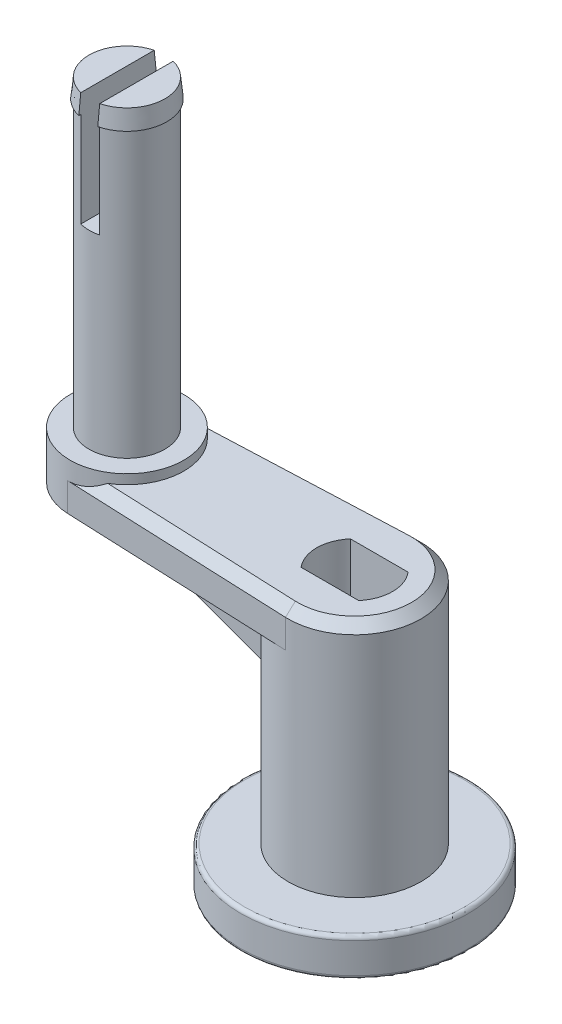
ISO-10303-21;
HEADER;
FILE_DESCRIPTION(('STEP AP214'),'2;1');
FILE_NAME('part.step','',(''),(''),'','','');
FILE_SCHEMA(('AUTOMOTIVE_DESIGN { 1 0 10303 214 1 1 1 1 }'));
ENDSEC;
DATA;
#1=APPLICATION_CONTEXT('core data for automotive mechanical design processes');
#2=APPLICATION_PROTOCOL_DEFINITION('international standard','automotive_design',2000,#1);
#3=PRODUCT_CONTEXT('',#1,'mechanical');
#4=PRODUCT('Part','Part','',(#3));
#5=PRODUCT_RELATED_PRODUCT_CATEGORY('part','',(#4));
#6=PRODUCT_DEFINITION_FORMATION('','',#4);
#7=PRODUCT_DEFINITION_CONTEXT('part definition',#1,'design');
#8=PRODUCT_DEFINITION('design','',#6,#7);
#9=PRODUCT_DEFINITION_SHAPE('','',#8);
#10=(LENGTH_UNIT() NAMED_UNIT(*) SI_UNIT(.MILLI.,.METRE.));
#11=(NAMED_UNIT(*) PLANE_ANGLE_UNIT() SI_UNIT($,.RADIAN.));
#12=(NAMED_UNIT(*) SI_UNIT($,.STERADIAN.) SOLID_ANGLE_UNIT());
#13=UNCERTAINTY_MEASURE_WITH_UNIT(LENGTH_MEASURE(1.E-05),#10,'distance_accuracy_value','');
#14=(GEOMETRIC_REPRESENTATION_CONTEXT(3) GLOBAL_UNCERTAINTY_ASSIGNED_CONTEXT((#13)) GLOBAL_UNIT_ASSIGNED_CONTEXT((#10,
#11,#12)) REPRESENTATION_CONTEXT('',''));
#15=CARTESIAN_POINT('',(0.,0.,0.));
#16=DIRECTION('',(0.,0.,1.));
#17=DIRECTION('',(1.,0.,0.));
#18=AXIS2_PLACEMENT_3D('',#15,#16,#17);
#19=CARTESIAN_POINT('',(-14.1,30.,0.));
#20=DIRECTION('',(0.,1.,0.));
#21=DIRECTION('',(0.,0.,1.));
#22=AXIS2_PLACEMENT_3D('',#19,#20,#21);
#23=PLANE('',#22);
#24=CARTESIAN_POINT('',(-12.,30.,0.));
#25=DIRECTION('',(0.,-1.,0.));
#26=DIRECTION('',(0.,0.,-1.));
#27=AXIS2_PLACEMENT_3D('',#24,#25,#26);
#28=CIRCLE('',#27,2.1);
#29=CARTESIAN_POINT('',(-11.5,30.,-2.03960780543711));
#30=VERTEX_POINT('',#29);
#31=CARTESIAN_POINT('',(-11.5,30.,2.03960780543711));
#32=VERTEX_POINT('',#31);
#33=EDGE_CURVE('E300',#30,#32,#28,.T.);
#34=ORIENTED_EDGE('',*,*,#33,.T.);
#35=DIRECTION('',(0.,0.,-1.));
#36=VECTOR('',#35,1.);
#37=CARTESIAN_POINT('',(-11.5,30.,0.));
#38=LINE('',#37,#36);
#39=CARTESIAN_POINT('',(-11.5,30.,1.93649167310371));
#40=VERTEX_POINT('',#39);
#41=EDGE_CURVE('E283',#32,#40,#38,.T.);
#42=ORIENTED_EDGE('',*,*,#41,.T.);
#43=CARTESIAN_POINT('',(-12.,30.,0.));
#44=DIRECTION('',(0.,1.,0.));
#45=DIRECTION('',(0.,0.,1.));
#46=AXIS2_PLACEMENT_3D('',#43,#44,#45);
#47=CIRCLE('',#46,2.);
#48=CARTESIAN_POINT('',(-11.5,30.,-1.9364916731037));
#49=VERTEX_POINT('',#48);
#50=EDGE_CURVE('E491',#40,#49,#47,.T.);
#51=ORIENTED_EDGE('',*,*,#50,.T.);
#52=EDGE_CURVE('E287',#49,#30,#38,.T.);
#53=ORIENTED_EDGE('',*,*,#52,.T.);
#54=EDGE_LOOP('',(#34,#42,#51,#53));
#55=FACE_BOUND('',#54,.T.);
#56=ADVANCED_FACE('F34',(#55),#23,.F.);
#57=CARTESIAN_POINT('',(-12.,31.,0.));
#58=DIRECTION('',(0.,-1.,0.));
#59=DIRECTION('',(0.,0.,-1.));
#60=AXIS2_PLACEMENT_3D('',#57,#58,#59);
#61=CONICAL_SURFACE('',#60,2.,0.0996686524911613);
#62=ORIENTED_EDGE('',*,*,#33,.F.);
#63=CARTESIAN_POINT('',(-11.5,26.841130436013,-2.36357986666356));
#64=CARTESIAN_POINT('',(-11.5,27.4581092019345,-2.30051294550378));
#65=CARTESIAN_POINT('',(-11.5,28.075077794743,-2.23734624093098));
#66=CARTESIAN_POINT('',(-11.5,29.3089863140136,-2.1107357912917));
#67=CARTESIAN_POINT('',(-11.5,29.9259262404865,-2.04729204632902));
#68=CARTESIAN_POINT('',(-11.5,31.1597696902874,-1.92004998262336));
#69=CARTESIAN_POINT('',(-11.5,31.7766732136083,-1.85625166381081));
#70=CARTESIAN_POINT('',(-11.5,33.0104289475399,-1.72815870123598));
#71=CARTESIAN_POINT('',(-11.5,33.627281158131,-1.66386405728527));
#72=CARTESIAN_POINT('',(-11.5,34.2441000838575,-1.59925039315231));
#73=B_SPLINE_CURVE_WITH_KNOTS('',3,(#63,#64,#65,#66,#67,#68,#69,#70,#71,#72),.UNSPECIFIED.,.F.,
.F.,(4,2,2,2,4),(0.,1.86058114819701,3.72116159936956,5.58174241557318,7.44232393822369),.UNSPECIFIED.);
#74=CARTESIAN_POINT('',(-11.5,31.,-1.93649167310371));
#75=VERTEX_POINT('',#74);
#76=EDGE_CURVE('E290',#30,#75,#73,.T.);
#77=ORIENTED_EDGE('',*,*,#76,.T.);
#78=CARTESIAN_POINT('',(-12.,31.,0.));
#79=DIRECTION('',(0.,-1.,0.));
#80=DIRECTION('',(0.,0.,-1.));
#81=AXIS2_PLACEMENT_3D('',#78,#79,#80);
#82=CIRCLE('',#81,2.);
#83=CARTESIAN_POINT('',(-11.5,31.,1.93649167310371));
#84=VERTEX_POINT('',#83);
#85=EDGE_CURVE('E304',#75,#84,#82,.T.);
#86=ORIENTED_EDGE('',*,*,#85,.T.);
#87=CARTESIAN_POINT('',(-11.5,34.2441000838575,1.59925039315231));
#88=CARTESIAN_POINT('',(-11.5,33.2336599431167,1.70508949991539));
#89=CARTESIAN_POINT('',(-11.5,32.2231318658387,1.81008354046584));
#90=CARTESIAN_POINT('',(-11.5,30.9893168649101,1.93760388991941));
#91=CARTESIAN_POINT('',(-11.5,30.766083590966,1.96064915154205));
#92=CARTESIAN_POINT('',(-11.5,29.9259262174672,2.04729297394069));
#93=CARTESIAN_POINT('',(-11.5,29.3089861080309,2.11073627491152));
#94=CARTESIAN_POINT('',(-11.5,28.0750774821184,2.23734581002695));
#95=CARTESIAN_POINT('',(-11.5,27.4581089656435,2.3005120441842));
#96=CARTESIAN_POINT('',(-11.5,26.841130436013,2.36357986666356));
#97=B_SPLINE_CURVE_WITH_KNOTS('',3,(#87,#88,#89,#90,#91,#92,#93,#94,#95,#96),.UNSPECIFIED.,.F.,
.F.,(4,2,2,2,4),(0.,3.04790325494799,3.72116219415059,5.58174303628262,7.44232379352004),.UNSPECIFIED.);
#98=EDGE_CURVE('E277',#84,#32,#97,.T.);
#99=ORIENTED_EDGE('',*,*,#98,.T.);
#100=EDGE_LOOP('',(#62,#77,#86,#99));
#101=FACE_BOUND('',#100,.T.);
#102=ADVANCED_FACE('F459',(#101),#61,.T.);
#103=CARTESIAN_POINT('',(-12.,31.,0.));
#104=DIRECTION('',(0.,1.,0.));
#105=DIRECTION('',(0.,0.,1.));
#106=AXIS2_PLACEMENT_3D('',#103,#104,#105);
#107=PLANE('',#106);
#108=DIRECTION('',(0.,0.,-1.));
#109=VECTOR('',#108,1.);
#110=CARTESIAN_POINT('',(-11.5,31.,0.));
#111=LINE('',#110,#109);
#112=EDGE_CURVE('E490',#84,#75,#111,.T.);
#113=ORIENTED_EDGE('',*,*,#112,.F.);
#114=ORIENTED_EDGE('',*,*,#85,.F.);
#115=EDGE_LOOP('',(#113,#114));
#116=FACE_BOUND('',#115,.T.);
#117=ADVANCED_FACE('F465',(#116),#107,.T.);
#118=CARTESIAN_POINT('',(-12.,31.,0.));
#119=DIRECTION('',(0.,-1.,0.));
#120=DIRECTION('',(0.,0.,-1.));
#121=AXIS2_PLACEMENT_3D('',#118,#119,#120);
#122=CYLINDRICAL_SURFACE('',#121,2.);
#123=ORIENTED_EDGE('',*,*,#50,.F.);
#124=DIRECTION('',(0.,-1.,0.));
#125=VECTOR('',#124,1.);
#126=CARTESIAN_POINT('',(-11.5,31.,1.93649167310371));
#127=LINE('',#126,#125);
#128=CARTESIAN_POINT('',(-11.5,25.,1.93649167310371));
#129=VERTEX_POINT('',#128);
#130=EDGE_CURVE('E286',#40,#129,#127,.T.);
#131=ORIENTED_EDGE('',*,*,#130,.T.);
#132=CARTESIAN_POINT('',(-12.,25.,0.));
#133=DIRECTION('',(0.,-1.,0.));
#134=DIRECTION('',(0.,0.,-1.));
#135=AXIS2_PLACEMENT_3D('',#132,#133,#134);
#136=CIRCLE('',#135,2.);
#137=CARTESIAN_POINT('',(-12.5,25.,1.93649167310371));
#138=VERTEX_POINT('',#137);
#139=EDGE_CURVE('E500',#129,#138,#136,.T.);
#140=ORIENTED_EDGE('',*,*,#139,.T.);
#141=DIRECTION('',(0.,-1.,0.));
#142=VECTOR('',#141,1.);
#143=CARTESIAN_POINT('',(-12.5,31.,1.93649167310371));
#144=LINE('',#143,#142);
#145=CARTESIAN_POINT('',(-12.5,30.,1.93649167310371));
#146=VERTEX_POINT('',#145);
#147=EDGE_CURVE('E273',#138,#146,#144,.F.);
#148=ORIENTED_EDGE('',*,*,#147,.T.);
#149=CARTESIAN_POINT('',(-12.5,30.,-1.93649167310371));
#150=VERTEX_POINT('',#149);
#151=EDGE_CURVE('E359',#150,#146,#47,.T.);
#152=ORIENTED_EDGE('',*,*,#151,.F.);
#153=DIRECTION('',(0.,-1.,0.));
#154=VECTOR('',#153,1.);
#155=CARTESIAN_POINT('',(-12.5,31.,-1.93649167310371));
#156=LINE('',#155,#154);
#157=CARTESIAN_POINT('',(-12.5,25.,-1.93649167310371));
#158=VERTEX_POINT('',#157);
#159=EDGE_CURVE('E274',#150,#158,#156,.T.);
#160=ORIENTED_EDGE('',*,*,#159,.T.);
#161=CARTESIAN_POINT('',(-11.5,25.,-1.9364916731037));
#162=VERTEX_POINT('',#161);
#163=EDGE_CURVE('E493',#158,#162,#136,.T.);
#164=ORIENTED_EDGE('',*,*,#163,.T.);
#165=DIRECTION('',(0.,-1.,0.));
#166=VECTOR('',#165,1.);
#167=CARTESIAN_POINT('',(-11.5,31.,-1.9364916731037));
#168=LINE('',#167,#166);
#169=EDGE_CURVE('E296',#162,#49,#168,.F.);
#170=ORIENTED_EDGE('',*,*,#169,.T.);
#171=EDGE_LOOP('',(#123,#131,#140,#148,#152,#160,#164,#170));
#172=FACE_BOUND('',#171,.T.);
#173=CARTESIAN_POINT('',(-12.,15.,0.));
#174=DIRECTION('',(0.,1.,0.));
#175=DIRECTION('',(0.,0.,1.));
#176=AXIS2_PLACEMENT_3D('',#173,#174,#175);
#177=CIRCLE('',#176,2.);
#178=CARTESIAN_POINT('',(-12.,15.,2.));
#179=VERTEX_POINT('',#178);
#180=EDGE_CURVE('E307',#179,#179,#177,.T.);
#181=ORIENTED_EDGE('',*,*,#180,.T.);
#182=EDGE_LOOP('',(#181));
#183=FACE_BOUND('',#182,.T.);
#184=ADVANCED_FACE('F540',(#172,#183),#122,.T.);
#185=CARTESIAN_POINT('',(-12.,15.,0.));
#186=DIRECTION('',(0.,1.,0.));
#187=DIRECTION('',(0.,0.,1.));
#188=AXIS2_PLACEMENT_3D('',#185,#186,#187);
#189=PLANE('',#188);
#190=CARTESIAN_POINT('',(-12.,15.,0.));
#191=DIRECTION('',(0.,1.,0.));
#192=DIRECTION('',(0.,0.,1.));
#193=AXIS2_PLACEMENT_3D('',#190,#191,#192);
#194=CIRCLE('',#193,3.);
#195=CARTESIAN_POINT('',(-12.,15.,3.));
#196=VERTEX_POINT('',#195);
#197=EDGE_CURVE('E310',#196,#196,#194,.T.);
#198=ORIENTED_EDGE('',*,*,#197,.T.);
#199=EDGE_LOOP('',(#198));
#200=FACE_BOUND('',#199,.T.);
#201=ORIENTED_EDGE('',*,*,#180,.F.);
#202=EDGE_LOOP('',(#201));
#203=FACE_BOUND('',#202,.T.);
#204=ADVANCED_FACE('F534',(#200,#203),#189,.T.);
#205=CARTESIAN_POINT('',(0.,14.5,0.));
#206=DIRECTION('',(0.,-1.,0.));
#207=DIRECTION('',(0.,0.,-1.));
#208=AXIS2_PLACEMENT_3D('',#205,#206,#207);
#209=CYLINDRICAL_SURFACE('',#208,3.5);
#210=CARTESIAN_POINT('',(0.,2.,0.));
#211=DIRECTION('',(0.,1.,0.));
#212=DIRECTION('',(0.,0.,1.));
#213=AXIS2_PLACEMENT_3D('',#210,#211,#212);
#214=CIRCLE('',#213,3.5);
#215=CARTESIAN_POINT('',(0.,2.,3.5));
#216=VERTEX_POINT('',#215);
#217=EDGE_CURVE('E338',#216,#216,#214,.T.);
#218=ORIENTED_EDGE('',*,*,#217,.T.);
#219=EDGE_LOOP('',(#218));
#220=FACE_BOUND('',#219,.T.);
#221=DIRECTION('',(0.,1.,0.));
#222=VECTOR('',#221,1.);
#223=CARTESIAN_POINT('',(-0.145833333333334,12.,-3.49696048574886));
#224=LINE('',#223,#222);
#225=CARTESIAN_POINT('',(-0.145833333333334,12.5,-3.49696048574886));
#226=VERTEX_POINT('',#225);
#227=CARTESIAN_POINT('',(-0.145833333333334,14.,-3.49696048574886));
#228=VERTEX_POINT('',#227);
#229=EDGE_CURVE('E331',#226,#228,#224,.T.);
#230=ORIENTED_EDGE('',*,*,#229,.T.);
#231=CARTESIAN_POINT('',(0.,14.,0.));
#232=DIRECTION('',(0.,1.,0.));
#233=DIRECTION('',(0.,0.,1.));
#234=AXIS2_PLACEMENT_3D('',#231,#232,#233);
#235=CIRCLE('',#234,3.5);
#236=CARTESIAN_POINT('',(-0.145833333333334,14.,3.49696048574886));
#237=VERTEX_POINT('',#236);
#238=EDGE_CURVE('E374',#228,#237,#235,.F.);
#239=ORIENTED_EDGE('',*,*,#238,.T.);
#240=DIRECTION('',(0.,1.,0.));
#241=VECTOR('',#240,1.);
#242=CARTESIAN_POINT('',(-0.145833333333334,12.,3.49696048574886));
#243=LINE('',#242,#241);
#244=CARTESIAN_POINT('',(-0.145833333333334,12.5,3.49696048574886));
#245=VERTEX_POINT('',#244);
#246=EDGE_CURVE('E335',#245,#237,#243,.T.);
#247=ORIENTED_EDGE('',*,*,#246,.F.);
#248=CARTESIAN_POINT('',(0.,9.,0.));
#249=DIRECTION('',(-0.0294627825494394,-0.707106781186547,0.70649270657555));
#250=DIRECTION('',(0.0294627825494394,-0.707106781186548,-0.706492706575548));
#251=AXIS2_PLACEMENT_3D('',#248,#249,#250);
#252=ELLIPSE('',#251,4.94974746830584,3.5);
#253=CARTESIAN_POINT('',(-1.92621004851986,12.,2.92227905049828));
#254=VERTEX_POINT('',#253);
#255=EDGE_CURVE('E376',#245,#254,#252,.T.);
#256=ORIENTED_EDGE('',*,*,#255,.T.);
#257=CARTESIAN_POINT('',(0.,12.,0.));
#258=DIRECTION('',(0.,1.,0.));
#259=DIRECTION('',(0.,0.,1.));
#260=AXIS2_PLACEMENT_3D('',#257,#258,#259);
#261=CIRCLE('',#260,3.5);
#262=CARTESIAN_POINT('',(-3.46410161513775,12.,0.5));
#263=VERTEX_POINT('',#262);
#264=EDGE_CURVE('E341',#263,#254,#261,.T.);
#265=ORIENTED_EDGE('',*,*,#264,.F.);
#266=DIRECTION('',(0.,-1.,0.));
#267=VECTOR('',#266,1.);
#268=CARTESIAN_POINT('',(-3.46410161513775,14.5,0.5));
#269=LINE('',#268,#267);
#270=CARTESIAN_POINT('',(-3.46410161513776,8.09603695095918,0.5));
#271=VERTEX_POINT('',#270);
#272=EDGE_CURVE('E322',#263,#271,#269,.T.);
#273=ORIENTED_EDGE('',*,*,#272,.T.);
#274=CARTESIAN_POINT('',(0.,6.83636363636364,0.));
#275=DIRECTION('',(-0.341743063086704,-0.939793423488437,0.));
#276=DIRECTION('',(0.939793423488437,-0.341743063086704,0.));
#277=AXIS2_PLACEMENT_3D('',#274,#275,#276);
#278=ELLIPSE('',#277,3.72422269886534,3.5);
#279=CARTESIAN_POINT('',(-3.46410161513776,8.09603695095918,-0.5));
#280=VERTEX_POINT('',#279);
#281=EDGE_CURVE('E327',#271,#280,#278,.T.);
#282=ORIENTED_EDGE('',*,*,#281,.T.);
#283=DIRECTION('',(0.,-1.,0.));
#284=VECTOR('',#283,1.);
#285=CARTESIAN_POINT('',(-3.46410161513775,14.5,-0.5));
#286=LINE('',#285,#284);
#287=CARTESIAN_POINT('',(-3.46410161513775,12.,-0.5));
#288=VERTEX_POINT('',#287);
#289=EDGE_CURVE('E325',#288,#280,#286,.T.);
#290=ORIENTED_EDGE('',*,*,#289,.F.);
#291=CARTESIAN_POINT('',(-1.92621004851986,12.,-2.92227905049828));
#292=VERTEX_POINT('',#291);
#293=EDGE_CURVE('E342',#292,#288,#261,.T.);
#294=ORIENTED_EDGE('',*,*,#293,.F.);
#295=CARTESIAN_POINT('',(0.,8.99999999999999,0.));
#296=DIRECTION('',(-0.0294627825494396,-0.707106781186546,-0.70649270657555));
#297=DIRECTION('',(0.0294627825494395,-0.707106781186549,0.706492706575548));
#298=AXIS2_PLACEMENT_3D('',#295,#296,#297);
#299=ELLIPSE('',#298,4.94974746830584,3.5);
#300=EDGE_CURVE('E378',#292,#226,#299,.T.);
#301=ORIENTED_EDGE('',*,*,#300,.T.);
#302=EDGE_LOOP('',(#230,#239,#247,#256,#265,#273,#282,#290,#294,#301));
#303=FACE_BOUND('',#302,.T.);
#304=ADVANCED_FACE('F431',(#220,#303),#209,.T.);
#305=CARTESIAN_POINT('',(-12.,12.,0.));
#306=DIRECTION('',(0.,1.,0.));
#307=DIRECTION('',(0.,0.,1.));
#308=AXIS2_PLACEMENT_3D('',#305,#306,#307);
#309=PLANE('',#308);
#310=ORIENTED_EDGE('',*,*,#264,.T.);
#311=DIRECTION('',(-0.999131567356817,0.,-0.0416666666666666));
#312=VECTOR('',#311,1.);
#313=CARTESIAN_POINT('',(-12.1041666666667,12.,2.49782891839204));
#314=LINE('',#313,#312);
#315=CARTESIAN_POINT('',(-12.1041666666667,12.,2.49782891839204));
#316=VERTEX_POINT('',#315);
#317=EDGE_CURVE('E360',#254,#316,#314,.T.);
#318=ORIENTED_EDGE('',*,*,#317,.T.);
#319=CARTESIAN_POINT('',(-12.,12.,0.));
#320=DIRECTION('',(0.,1.,0.));
#321=DIRECTION('',(0.,0.,1.));
#322=AXIS2_PLACEMENT_3D('',#319,#320,#321);
#323=CIRCLE('',#322,2.5);
#324=CARTESIAN_POINT('',(-12.1041666666667,12.,-2.49782891839204));
#325=VERTEX_POINT('',#324);
#326=EDGE_CURVE('E412',#316,#325,#323,.F.);
#327=ORIENTED_EDGE('',*,*,#326,.T.);
#328=DIRECTION('',(0.999131567356817,0.,-0.0416666666666668));
#329=VECTOR('',#328,1.);
#330=CARTESIAN_POINT('',(-0.125000000000001,12.,-2.99739470207045));
#331=LINE('',#330,#329);
#332=EDGE_CURVE('E405',#325,#292,#331,.T.);
#333=ORIENTED_EDGE('',*,*,#332,.T.);
#334=ORIENTED_EDGE('',*,*,#293,.T.);
#335=DIRECTION('',(1.,0.,0.));
#336=VECTOR('',#335,1.);
#337=CARTESIAN_POINT('',(-12.,12.,-0.5));
#338=LINE('',#337,#336);
#339=CARTESIAN_POINT('',(-14.2,12.,-0.5));
#340=VERTEX_POINT('',#339);
#341=EDGE_CURVE('E347',#340,#288,#338,.T.);
#342=ORIENTED_EDGE('',*,*,#341,.F.);
#343=DIRECTION('',(0.,0.,1.));
#344=VECTOR('',#343,1.);
#345=CARTESIAN_POINT('',(-14.2,12.,-0.5));
#346=LINE('',#345,#344);
#347=CARTESIAN_POINT('',(-14.2,12.,0.5));
#348=VERTEX_POINT('',#347);
#349=EDGE_CURVE('E319',#340,#348,#346,.T.);
#350=ORIENTED_EDGE('',*,*,#349,.T.);
#351=DIRECTION('',(1.,0.,0.));
#352=VECTOR('',#351,1.);
#353=CARTESIAN_POINT('',(-12.,12.,0.5));
#354=LINE('',#353,#352);
#355=EDGE_CURVE('E344',#348,#263,#354,.T.);
#356=ORIENTED_EDGE('',*,*,#355,.T.);
#357=EDGE_LOOP('',(#310,#318,#327,#333,#334,#342,#350,#356));
#358=FACE_BOUND('',#357,.T.);
#359=ADVANCED_FACE('F418',(#358),#309,.F.);
#360=CARTESIAN_POINT('',(0.,2.,0.));
#361=DIRECTION('',(0.,1.,0.));
#362=DIRECTION('',(0.,0.,1.));
#363=AXIS2_PLACEMENT_3D('',#360,#361,#362);
#364=PLANE('',#363);
#365=CARTESIAN_POINT('',(0.,2.,0.));
#366=DIRECTION('',(0.,1.,0.));
#367=DIRECTION('',(0.,0.,1.));
#368=AXIS2_PLACEMENT_3D('',#365,#366,#367);
#369=CIRCLE('',#368,5.8);
#370=CARTESIAN_POINT('',(0.,2.,5.8));
#371=VERTEX_POINT('',#370);
#372=EDGE_CURVE('E402',#371,#371,#369,.T.);
#373=ORIENTED_EDGE('',*,*,#372,.T.);
#374=EDGE_LOOP('',(#373));
#375=FACE_BOUND('',#374,.T.);
#376=ORIENTED_EDGE('',*,*,#217,.F.);
#377=EDGE_LOOP('',(#376));
#378=FACE_BOUND('',#377,.T.);
#379=ADVANCED_FACE('F519',(#375,#378),#364,.T.);
#380=CARTESIAN_POINT('',(0.,2.,0.));
#381=DIRECTION('',(0.,-1.,0.));
#382=DIRECTION('',(0.,0.,-1.));
#383=AXIS2_PLACEMENT_3D('',#380,#381,#382);
#384=CYLINDRICAL_SURFACE('',#383,6.);
#385=CARTESIAN_POINT('',(0.,0.2,0.));
#386=DIRECTION('',(0.,1.,0.));
#387=DIRECTION('',(0.,0.,1.));
#388=AXIS2_PLACEMENT_3D('',#385,#386,#387);
#389=CIRCLE('',#388,6.);
#390=CARTESIAN_POINT('',(0.,0.2,6.));
#391=VERTEX_POINT('',#390);
#392=EDGE_CURVE('E504',#391,#391,#389,.T.);
#393=ORIENTED_EDGE('',*,*,#392,.T.);
#394=EDGE_LOOP('',(#393));
#395=FACE_BOUND('',#394,.T.);
#396=CARTESIAN_POINT('',(0.,1.8,0.));
#397=DIRECTION('',(0.,1.,0.));
#398=DIRECTION('',(0.,0.,1.));
#399=AXIS2_PLACEMENT_3D('',#396,#397,#398);
#400=CIRCLE('',#399,6.);
#401=CARTESIAN_POINT('',(0.,1.8,6.));
#402=VERTEX_POINT('',#401);
#403=EDGE_CURVE('E501',#402,#402,#400,.F.);
#404=ORIENTED_EDGE('',*,*,#403,.T.);
#405=EDGE_LOOP('',(#404));
#406=FACE_BOUND('',#405,.T.);
#407=ADVANCED_FACE('F454',(#395,#406),#384,.T.);
#408=CARTESIAN_POINT('',(0.,0.,0.));
#409=DIRECTION('',(0.,1.,0.));
#410=DIRECTION('',(0.,0.,1.));
#411=AXIS2_PLACEMENT_3D('',#408,#409,#410);
#412=PLANE('',#411);
#413=CARTESIAN_POINT('',(0.,0.,0.));
#414=DIRECTION('',(0.,1.,0.));
#415=DIRECTION('',(0.,0.,1.));
#416=AXIS2_PLACEMENT_3D('',#413,#414,#415);
#417=CIRCLE('',#416,5.8);
#418=CARTESIAN_POINT('',(0.,0.,5.8));
#419=VERTEX_POINT('',#418);
#420=EDGE_CURVE('E408',#419,#419,#417,.F.);
#421=ORIENTED_EDGE('',*,*,#420,.T.);
#422=EDGE_LOOP('',(#421));
#423=FACE_BOUND('',#422,.T.);
#424=DIRECTION('',(1.,0.,0.));
#425=VECTOR('',#424,1.);
#426=CARTESIAN_POINT('',(1.51986841535707,0.,1.3));
#427=LINE('',#426,#425);
#428=CARTESIAN_POINT('',(-1.51986841535707,0.,1.3));
#429=VERTEX_POINT('',#428);
#430=CARTESIAN_POINT('',(1.51986841535707,0.,1.3));
#431=VERTEX_POINT('',#430);
#432=EDGE_CURVE('E203',#429,#431,#427,.T.);
#433=ORIENTED_EDGE('',*,*,#432,.T.);
#434=CARTESIAN_POINT('',(0.,0.,0.));
#435=DIRECTION('',(0.,1.,0.));
#436=DIRECTION('',(0.,0.,1.));
#437=AXIS2_PLACEMENT_3D('',#434,#435,#436);
#438=CIRCLE('',#437,2.);
#439=CARTESIAN_POINT('',(1.51986841535707,0.,-1.3));
#440=VERTEX_POINT('',#439);
#441=EDGE_CURVE('E195',#431,#440,#438,.T.);
#442=ORIENTED_EDGE('',*,*,#441,.T.);
#443=DIRECTION('',(-1.,0.,0.));
#444=VECTOR('',#443,1.);
#445=CARTESIAN_POINT('',(1.51986841535707,0.,-1.3));
#446=LINE('',#445,#444);
#447=CARTESIAN_POINT('',(-1.51986841535707,0.,-1.3));
#448=VERTEX_POINT('',#447);
#449=EDGE_CURVE('E207',#440,#448,#446,.T.);
#450=ORIENTED_EDGE('',*,*,#449,.T.);
#451=CARTESIAN_POINT('',(0.,0.,0.));
#452=DIRECTION('',(0.,1.,0.));
#453=DIRECTION('',(0.,0.,1.));
#454=AXIS2_PLACEMENT_3D('',#451,#452,#453);
#455=CIRCLE('',#454,2.);
#456=EDGE_CURVE('E211',#448,#429,#455,.T.);
#457=ORIENTED_EDGE('',*,*,#456,.T.);
#458=EDGE_LOOP('',(#433,#442,#450,#457));
#459=FACE_BOUND('',#458,.T.);
#460=ADVANCED_FACE('F213',(#423,#459),#412,.F.);
#461=CARTESIAN_POINT('',(0.,14.5,0.));
#462=DIRECTION('',(0.,1.,0.));
#463=DIRECTION('',(0.,0.,1.));
#464=AXIS2_PLACEMENT_3D('',#461,#462,#463);
#465=PLANE('',#464);
#466=CARTESIAN_POINT('',(0.,14.5,0.));
#467=DIRECTION('',(0.,1.,0.));
#468=DIRECTION('',(0.,0.,1.));
#469=AXIS2_PLACEMENT_3D('',#466,#467,#468);
#470=CIRCLE('',#469,2.);
#471=CARTESIAN_POINT('',(1.51986841535707,14.5,1.3));
#472=VERTEX_POINT('',#471);
#473=CARTESIAN_POINT('',(1.51986841535707,14.5,-1.3));
#474=VERTEX_POINT('',#473);
#475=EDGE_CURVE('E198',#472,#474,#470,.T.);
#476=ORIENTED_EDGE('',*,*,#475,.F.);
#477=DIRECTION('',(1.,0.,0.));
#478=VECTOR('',#477,1.);
#479=CARTESIAN_POINT('',(1.51986841535707,14.5,1.3));
#480=LINE('',#479,#478);
#481=CARTESIAN_POINT('',(-1.51986841535707,14.5,1.3));
#482=VERTEX_POINT('',#481);
#483=EDGE_CURVE('E215',#482,#472,#480,.T.);
#484=ORIENTED_EDGE('',*,*,#483,.F.);
#485=CARTESIAN_POINT('',(0.,14.5,0.));
#486=DIRECTION('',(0.,1.,0.));
#487=DIRECTION('',(0.,0.,1.));
#488=AXIS2_PLACEMENT_3D('',#485,#486,#487);
#489=CIRCLE('',#488,2.);
#490=CARTESIAN_POINT('',(-1.51986841535707,14.5,-1.3));
#491=VERTEX_POINT('',#490);
#492=EDGE_CURVE('E218',#491,#482,#489,.T.);
#493=ORIENTED_EDGE('',*,*,#492,.F.);
#494=DIRECTION('',(-1.,0.,0.));
#495=VECTOR('',#494,1.);
#496=CARTESIAN_POINT('',(1.51986841535707,14.5,-1.3));
#497=LINE('',#496,#495);
#498=EDGE_CURVE('E224',#474,#491,#497,.T.);
#499=ORIENTED_EDGE('',*,*,#498,.F.);
#500=EDGE_LOOP('',(#476,#484,#493,#499));
#501=FACE_BOUND('',#500,.T.);
#502=CARTESIAN_POINT('',(0.,14.5,0.));
#503=DIRECTION('',(0.,1.,0.));
#504=DIRECTION('',(0.,0.,1.));
#505=AXIS2_PLACEMENT_3D('',#502,#503,#504);
#506=CIRCLE('',#505,2.99999999999999);
#507=CARTESIAN_POINT('',(-0.125,14.5,2.99739470207044));
#508=VERTEX_POINT('',#507);
#509=CARTESIAN_POINT('',(-0.125,14.5,-2.99739470207044));
#510=VERTEX_POINT('',#509);
#511=EDGE_CURVE('E51',#508,#510,#506,.T.);
#512=ORIENTED_EDGE('',*,*,#511,.T.);
#513=DIRECTION('',(-0.999131567356817,0.,0.0416666666666668));
#514=VECTOR('',#513,1.);
#515=CARTESIAN_POINT('',(-0.125,14.5,-2.99739470207044));
#516=LINE('',#515,#514);
#517=CARTESIAN_POINT('',(-10.4472944041055,14.5,-2.56692526819111));
#518=VERTEX_POINT('',#517);
#519=EDGE_CURVE('E372',#510,#518,#516,.T.);
#520=ORIENTED_EDGE('',*,*,#519,.T.);
#521=CARTESIAN_POINT('',(-12.,14.5,0.));
#522=DIRECTION('',(0.,1.,0.));
#523=DIRECTION('',(0.,0.,1.));
#524=AXIS2_PLACEMENT_3D('',#521,#522,#523);
#525=CIRCLE('',#524,3.);
#526=CARTESIAN_POINT('',(-10.4472944041055,14.5,2.56692526819111));
#527=VERTEX_POINT('',#526);
#528=EDGE_CURVE('E350',#527,#518,#525,.T.);
#529=ORIENTED_EDGE('',*,*,#528,.F.);
#530=DIRECTION('',(0.999131567356817,0.,0.0416666666666666));
#531=VECTOR('',#530,1.);
#532=CARTESIAN_POINT('',(-0.124999999999999,14.5,2.99739470207044));
#533=LINE('',#532,#531);
#534=EDGE_CURVE('E56',#527,#508,#533,.T.);
#535=ORIENTED_EDGE('',*,*,#534,.T.);
#536=EDGE_LOOP('',(#512,#520,#529,#535));
#537=FACE_BOUND('',#536,.T.);
#538=ADVANCED_FACE('F445',(#501,#537),#465,.T.);
#539=CARTESIAN_POINT('',(-12.,12.,0.));
#540=DIRECTION('',(0.,1.,0.));
#541=DIRECTION('',(0.,0.,1.));
#542=AXIS2_PLACEMENT_3D('',#539,#540,#541);
#543=CYLINDRICAL_SURFACE('',#542,3.);
#544=DIRECTION('',(0.,1.,0.));
#545=VECTOR('',#544,1.);
#546=CARTESIAN_POINT('',(-12.125,12.,-2.99739470207045));
#547=LINE('',#546,#545);
#548=CARTESIAN_POINT('',(-12.125,12.5,-2.99739470207045));
#549=VERTEX_POINT('',#548);
#550=CARTESIAN_POINT('',(-12.125,14.,-2.99739470207045));
#551=VERTEX_POINT('',#550);
#552=EDGE_CURVE('E334',#549,#551,#547,.T.);
#553=ORIENTED_EDGE('',*,*,#552,.F.);
#554=CARTESIAN_POINT('',(-12.,12.5,0.));
#555=DIRECTION('',(0.,1.,0.));
#556=DIRECTION('',(0.,0.,1.));
#557=AXIS2_PLACEMENT_3D('',#554,#555,#556);
#558=CIRCLE('',#557,3.);
#559=CARTESIAN_POINT('',(-12.125,12.5,2.99739470207045));
#560=VERTEX_POINT('',#559);
#561=EDGE_CURVE('E364',#549,#560,#558,.T.);
#562=ORIENTED_EDGE('',*,*,#561,.T.);
#563=DIRECTION('',(0.,1.,0.));
#564=VECTOR('',#563,1.);
#565=CARTESIAN_POINT('',(-12.125,12.,2.99739470207045));
#566=LINE('',#565,#564);
#567=CARTESIAN_POINT('',(-12.125,14.,2.99739470207045));
#568=VERTEX_POINT('',#567);
#569=EDGE_CURVE('E330',#560,#568,#566,.T.);
#570=ORIENTED_EDGE('',*,*,#569,.T.);
#571=CARTESIAN_POINT('',(-12.,17.,0.));
#572=DIRECTION('',(0.0294627825494396,-0.707106781186544,-0.706492706575552));
#573=DIRECTION('',(0.0294627825494393,0.707106781186551,-0.706492706575546));
#574=AXIS2_PLACEMENT_3D('',#571,#572,#573);
#575=ELLIPSE('',#574,4.2426406871193,3.);
#576=EDGE_CURVE('E11',#568,#527,#575,.F.);
#577=ORIENTED_EDGE('',*,*,#576,.T.);
#578=ORIENTED_EDGE('',*,*,#528,.T.);
#579=CARTESIAN_POINT('',(-12.,17.,0.));
#580=DIRECTION('',(0.0294627825494397,-0.707106781186544,0.706492706575552));
#581=DIRECTION('',(0.0294627825494394,0.707106781186551,0.706492706575546));
#582=AXIS2_PLACEMENT_3D('',#579,#580,#581);
#583=ELLIPSE('',#582,4.2426406871193,3.);
#584=EDGE_CURVE('E43',#518,#551,#583,.F.);
#585=ORIENTED_EDGE('',*,*,#584,.T.);
#586=EDGE_LOOP('',(#553,#562,#570,#577,#578,#585));
#587=FACE_BOUND('',#586,.T.);
#588=ORIENTED_EDGE('',*,*,#197,.F.);
#589=EDGE_LOOP('',(#588));
#590=FACE_BOUND('',#589,.T.);
#591=ADVANCED_FACE('F442',(#587,#590),#543,.T.);
#592=CARTESIAN_POINT('',(-12.125,12.,-2.99739470207045));
#593=DIRECTION('',(-0.0416666666666668,0.,-0.999131567356817));
#594=DIRECTION('',(-0.999131567356817,0.,0.0416666666666668));
#595=AXIS2_PLACEMENT_3D('',#592,#593,#594);
#596=PLANE('',#595);
#597=ORIENTED_EDGE('',*,*,#229,.F.);
#598=DIRECTION('',(-0.999131567356817,0.,0.0416666666666668));
#599=VECTOR('',#598,1.);
#600=CARTESIAN_POINT('',(-12.125,12.5,-2.99739470207045));
#601=LINE('',#600,#599);
#602=EDGE_CURVE('E368',#226,#549,#601,.T.);
#603=ORIENTED_EDGE('',*,*,#602,.T.);
#604=ORIENTED_EDGE('',*,*,#552,.T.);
#605=DIRECTION('',(0.999131567356817,0.,-0.0416666666666668));
#606=VECTOR('',#605,1.);
#607=CARTESIAN_POINT('',(-12.125,14.,-2.99739470207045));
#608=LINE('',#607,#606);
#609=EDGE_CURVE('E366',#551,#228,#608,.T.);
#610=ORIENTED_EDGE('',*,*,#609,.T.);
#611=EDGE_LOOP('',(#597,#603,#604,#610));
#612=FACE_BOUND('',#611,.T.);
#613=ADVANCED_FACE('F437',(#612),#596,.T.);
#614=CARTESIAN_POINT('',(-12.125,12.,2.99739470207045));
#615=DIRECTION('',(-0.0416666666666666,0.,0.999131567356817));
#616=DIRECTION('',(0.999131567356817,0.,0.0416666666666666));
#617=AXIS2_PLACEMENT_3D('',#614,#615,#616);
#618=PLANE('',#617);
#619=ORIENTED_EDGE('',*,*,#569,.F.);
#620=DIRECTION('',(0.999131567356817,0.,0.0416666666666666));
#621=VECTOR('',#620,1.);
#622=CARTESIAN_POINT('',(-0.145833333333334,12.5,3.49696048574886));
#623=LINE('',#622,#621);
#624=EDGE_CURVE('E401',#560,#245,#623,.T.);
#625=ORIENTED_EDGE('',*,*,#624,.T.);
#626=ORIENTED_EDGE('',*,*,#246,.T.);
#627=DIRECTION('',(-0.999131567356817,0.,-0.0416666666666666));
#628=VECTOR('',#627,1.);
#629=CARTESIAN_POINT('',(-12.125,14.,2.99739470207045));
#630=LINE('',#629,#628);
#631=EDGE_CURVE('E397',#237,#568,#630,.T.);
#632=ORIENTED_EDGE('',*,*,#631,.T.);
#633=EDGE_LOOP('',(#619,#625,#626,#632));
#634=FACE_BOUND('',#633,.T.);
#635=ADVANCED_FACE('F429',(#634),#618,.T.);
#636=CARTESIAN_POINT('',(-3.2,8.,-0.5));
#637=DIRECTION('',(-0.341743063086704,-0.939793423488437,0.));
#638=DIRECTION('',(0.939793423488437,-0.341743063086704,0.));
#639=AXIS2_PLACEMENT_3D('',#636,#637,#638);
#640=PLANE('',#639);
#641=ORIENTED_EDGE('',*,*,#281,.F.);
#642=DIRECTION('',(0.939793423488437,-0.341743063086704,0.));
#643=VECTOR('',#642,1.);
#644=CARTESIAN_POINT('',(-14.2,12.,0.5));
#645=LINE('',#644,#643);
#646=EDGE_CURVE('E313',#348,#271,#645,.T.);
#647=ORIENTED_EDGE('',*,*,#646,.F.);
#648=ORIENTED_EDGE('',*,*,#349,.F.);
#649=DIRECTION('',(0.939793423488437,-0.341743063086704,0.));
#650=VECTOR('',#649,1.);
#651=CARTESIAN_POINT('',(-14.2,12.,-0.5));
#652=LINE('',#651,#650);
#653=EDGE_CURVE('E316',#340,#280,#652,.T.);
#654=ORIENTED_EDGE('',*,*,#653,.T.);
#655=EDGE_LOOP('',(#641,#647,#648,#654));
#656=FACE_BOUND('',#655,.T.);
#657=ADVANCED_FACE('F685',(#656),#640,.T.);
#658=CARTESIAN_POINT('',(0.,0.,-0.5));
#659=DIRECTION('',(0.,0.,1.));
#660=DIRECTION('',(1.,0.,0.));
#661=AXIS2_PLACEMENT_3D('',#658,#659,#660);
#662=PLANE('',#661);
#663=ORIENTED_EDGE('',*,*,#341,.T.);
#664=ORIENTED_EDGE('',*,*,#289,.T.);
#665=ORIENTED_EDGE('',*,*,#653,.F.);
#666=EDGE_LOOP('',(#663,#664,#665));
#667=FACE_BOUND('',#666,.T.);
#668=ADVANCED_FACE('F476',(#667),#662,.F.);
#669=CARTESIAN_POINT('',(0.,0.,0.5));
#670=DIRECTION('',(0.,0.,1.));
#671=DIRECTION('',(1.,0.,0.));
#672=AXIS2_PLACEMENT_3D('',#669,#670,#671);
#673=PLANE('',#672);
#674=ORIENTED_EDGE('',*,*,#272,.F.);
#675=ORIENTED_EDGE('',*,*,#355,.F.);
#676=ORIENTED_EDGE('',*,*,#646,.T.);
#677=EDGE_LOOP('',(#674,#675,#676));
#678=FACE_BOUND('',#677,.T.);
#679=ADVANCED_FACE('F468',(#678),#673,.T.);
#680=CARTESIAN_POINT('',(-12.5,30.,2.03960780543712));
#681=VERTEX_POINT('',#680);
#682=CARTESIAN_POINT('',(-12.5,30.,-2.03960780543712));
#683=VERTEX_POINT('',#682);
#684=EDGE_CURVE('E299',#681,#683,#28,.T.);
#685=ORIENTED_EDGE('',*,*,#684,.T.);
#686=DIRECTION('',(0.,0.,1.));
#687=VECTOR('',#686,1.);
#688=CARTESIAN_POINT('',(-12.5,30.,0.));
#689=LINE('',#688,#687);
#690=EDGE_CURVE('E272',#683,#150,#689,.T.);
#691=ORIENTED_EDGE('',*,*,#690,.T.);
#692=ORIENTED_EDGE('',*,*,#151,.T.);
#693=EDGE_CURVE('E248',#146,#681,#689,.T.);
#694=ORIENTED_EDGE('',*,*,#693,.T.);
#695=EDGE_LOOP('',(#685,#691,#692,#694));
#696=FACE_BOUND('',#695,.T.);
#697=ADVANCED_FACE('F461',(#696),#23,.F.);
#698=CARTESIAN_POINT('',(-12.5,31.,1.93649167310371));
#699=VERTEX_POINT('',#698);
#700=CARTESIAN_POINT('',(-12.5,31.,-1.93649167310371));
#701=VERTEX_POINT('',#700);
#702=EDGE_CURVE('E303',#699,#701,#82,.T.);
#703=ORIENTED_EDGE('',*,*,#702,.T.);
#704=CARTESIAN_POINT('',(-12.5,34.2441000838575,-1.59925039315232));
#705=CARTESIAN_POINT('',(-12.5,33.2336599431167,-1.7050894999154));
#706=CARTESIAN_POINT('',(-12.5,32.2231318658387,-1.81008354046585));
#707=CARTESIAN_POINT('',(-12.5,30.9893168649102,-1.93760388991941));
#708=CARTESIAN_POINT('',(-12.5,30.766083590966,-1.96064915154206));
#709=CARTESIAN_POINT('',(-12.5,29.9259262174672,-2.0472929739407));
#710=CARTESIAN_POINT('',(-12.5,29.3089861080309,-2.11073627491152));
#711=CARTESIAN_POINT('',(-12.5,28.0750774821184,-2.23734581002695));
#712=CARTESIAN_POINT('',(-12.5,27.4581089656435,-2.3005120441842));
#713=CARTESIAN_POINT('',(-12.5,26.841130436013,-2.36357986666357));
#714=B_SPLINE_CURVE_WITH_KNOTS('',3,(#704,#705,#706,#707,#708,#709,#710,#711,#712,#713),
.UNSPECIFIED.,.F.,.F.,(4,2,2,2,4),(0.,3.04790325494799,3.7211621941506,5.58174303628262,
7.44232379352004),.UNSPECIFIED.);
#715=EDGE_CURVE('E266',#701,#683,#714,.T.);
#716=ORIENTED_EDGE('',*,*,#715,.T.);
#717=ORIENTED_EDGE('',*,*,#684,.F.);
#718=CARTESIAN_POINT('',(-12.5,26.841130436013,2.36357986666357));
#719=CARTESIAN_POINT('',(-12.5,27.4581092019345,2.30051294550378));
#720=CARTESIAN_POINT('',(-12.5,28.075077794743,2.23734624093098));
#721=CARTESIAN_POINT('',(-12.5,29.3089863140136,2.11073579129171));
#722=CARTESIAN_POINT('',(-12.5,29.9259262404865,2.04729204632903));
#723=CARTESIAN_POINT('',(-12.5,31.1597696902874,1.92004998262336));
#724=CARTESIAN_POINT('',(-12.5,31.7766732136083,1.85625166381081));
#725=CARTESIAN_POINT('',(-12.5,33.0104289475399,1.72815870123599));
#726=CARTESIAN_POINT('',(-12.5,33.627281158131,1.66386405728527));
#727=CARTESIAN_POINT('',(-12.5,34.2441000838575,1.59925039315232));
#728=B_SPLINE_CURVE_WITH_KNOTS('',3,(#718,#719,#720,#721,#722,#723,#724,#725,#726,#727),
.UNSPECIFIED.,.F.,.F.,(4,2,2,2,4),(0.,1.86058114819701,3.72116159936956,5.58174241557317,
7.44232393822369),.UNSPECIFIED.);
#729=EDGE_CURVE('E240',#681,#699,#728,.T.);
#730=ORIENTED_EDGE('',*,*,#729,.T.);
#731=EDGE_LOOP('',(#703,#716,#717,#730));
#732=FACE_BOUND('',#731,.T.);
#733=ADVANCED_FACE('F250',(#732),#61,.T.);
#734=DIRECTION('',(0.,0.,1.));
#735=VECTOR('',#734,1.);
#736=CARTESIAN_POINT('',(-12.5,31.,0.));
#737=LINE('',#736,#735);
#738=EDGE_CURVE('E488',#701,#699,#737,.T.);
#739=ORIENTED_EDGE('',*,*,#738,.F.);
#740=ORIENTED_EDGE('',*,*,#702,.F.);
#741=EDGE_LOOP('',(#739,#740));
#742=FACE_BOUND('',#741,.T.);
#743=ADVANCED_FACE('F474',(#742),#107,.T.);
#744=CARTESIAN_POINT('',(0.,25.,0.));
#745=DIRECTION('',(0.,-1.,0.));
#746=DIRECTION('',(0.,0.,-1.));
#747=AXIS2_PLACEMENT_3D('',#744,#745,#746);
#748=PLANE('',#747);
#749=DIRECTION('',(0.,0.,-1.));
#750=VECTOR('',#749,1.);
#751=CARTESIAN_POINT('',(-11.5,25.,-3.));
#752=LINE('',#751,#750);
#753=EDGE_CURVE('E231',#129,#162,#752,.T.);
#754=ORIENTED_EDGE('',*,*,#753,.T.);
#755=ORIENTED_EDGE('',*,*,#163,.F.);
#756=DIRECTION('',(0.,0.,1.));
#757=VECTOR('',#756,1.);
#758=CARTESIAN_POINT('',(-12.5,25.,-3.));
#759=LINE('',#758,#757);
#760=EDGE_CURVE('E237',#158,#138,#759,.T.);
#761=ORIENTED_EDGE('',*,*,#760,.T.);
#762=ORIENTED_EDGE('',*,*,#139,.F.);
#763=EDGE_LOOP('',(#754,#755,#761,#762));
#764=FACE_BOUND('',#763,.T.);
#765=ADVANCED_FACE('F261',(#764),#748,.F.);
#766=CARTESIAN_POINT('',(-11.5,25.,-3.));
#767=DIRECTION('',(1.,0.,0.));
#768=DIRECTION('',(0.,0.,-1.));
#769=AXIS2_PLACEMENT_3D('',#766,#767,#768);
#770=PLANE('',#769);
#771=ORIENTED_EDGE('',*,*,#753,.F.);
#772=ORIENTED_EDGE('',*,*,#130,.F.);
#773=ORIENTED_EDGE('',*,*,#41,.F.);
#774=ORIENTED_EDGE('',*,*,#98,.F.);
#775=ORIENTED_EDGE('',*,*,#112,.T.);
#776=ORIENTED_EDGE('',*,*,#76,.F.);
#777=ORIENTED_EDGE('',*,*,#52,.F.);
#778=ORIENTED_EDGE('',*,*,#169,.F.);
#779=EDGE_LOOP('',(#771,#772,#773,#774,#775,#776,#777,#778));
#780=FACE_BOUND('',#779,.T.);
#781=ADVANCED_FACE('F259',(#780),#770,.F.);
#782=CARTESIAN_POINT('',(-12.5,25.,-3.));
#783=DIRECTION('',(-1.,0.,0.));
#784=DIRECTION('',(0.,0.,1.));
#785=AXIS2_PLACEMENT_3D('',#782,#783,#784);
#786=PLANE('',#785);
#787=ORIENTED_EDGE('',*,*,#690,.F.);
#788=ORIENTED_EDGE('',*,*,#715,.F.);
#789=ORIENTED_EDGE('',*,*,#738,.T.);
#790=ORIENTED_EDGE('',*,*,#729,.F.);
#791=ORIENTED_EDGE('',*,*,#693,.F.);
#792=ORIENTED_EDGE('',*,*,#147,.F.);
#793=ORIENTED_EDGE('',*,*,#760,.F.);
#794=ORIENTED_EDGE('',*,*,#159,.F.);
#795=EDGE_LOOP('',(#787,#788,#789,#790,#791,#792,#793,#794));
#796=FACE_BOUND('',#795,.T.);
#797=ADVANCED_FACE('F254',(#796),#786,.F.);
#798=CARTESIAN_POINT('',(0.,0.,0.));
#799=DIRECTION('',(0.,1.,0.));
#800=DIRECTION('',(0.,0.,1.));
#801=AXIS2_PLACEMENT_3D('',#798,#799,#800);
#802=CYLINDRICAL_SURFACE('',#801,2.);
#803=ORIENTED_EDGE('',*,*,#475,.T.);
#804=DIRECTION('',(0.,1.,0.));
#805=VECTOR('',#804,1.);
#806=CARTESIAN_POINT('',(1.51986841535707,0.,-1.3));
#807=LINE('',#806,#805);
#808=EDGE_CURVE('E191',#440,#474,#807,.T.);
#809=ORIENTED_EDGE('',*,*,#808,.F.);
#810=ORIENTED_EDGE('',*,*,#441,.F.);
#811=DIRECTION('',(0.,1.,0.));
#812=VECTOR('',#811,1.);
#813=CARTESIAN_POINT('',(1.51986841535707,0.,1.3));
#814=LINE('',#813,#812);
#815=EDGE_CURVE('E229',#431,#472,#814,.T.);
#816=ORIENTED_EDGE('',*,*,#815,.T.);
#817=EDGE_LOOP('',(#803,#809,#810,#816));
#818=FACE_BOUND('',#817,.T.);
#819=ADVANCED_FACE('F193',(#818),#802,.F.);
#820=CARTESIAN_POINT('',(1.51986841535707,0.,1.3));
#821=DIRECTION('',(0.,0.,1.));
#822=DIRECTION('',(1.,0.,0.));
#823=AXIS2_PLACEMENT_3D('',#820,#821,#822);
#824=PLANE('',#823);
#825=ORIENTED_EDGE('',*,*,#483,.T.);
#826=ORIENTED_EDGE('',*,*,#815,.F.);
#827=ORIENTED_EDGE('',*,*,#432,.F.);
#828=DIRECTION('',(0.,1.,0.));
#829=VECTOR('',#828,1.);
#830=CARTESIAN_POINT('',(-1.51986841535707,0.,1.3));
#831=LINE('',#830,#829);
#832=EDGE_CURVE('E232',#429,#482,#831,.T.);
#833=ORIENTED_EDGE('',*,*,#832,.T.);
#834=EDGE_LOOP('',(#825,#826,#827,#833));
#835=FACE_BOUND('',#834,.T.);
#836=ADVANCED_FACE('F593',(#835),#824,.F.);
#837=CARTESIAN_POINT('',(0.,0.,0.));
#838=DIRECTION('',(0.,1.,0.));
#839=DIRECTION('',(0.,0.,1.));
#840=AXIS2_PLACEMENT_3D('',#837,#838,#839);
#841=CYLINDRICAL_SURFACE('',#840,2.);
#842=ORIENTED_EDGE('',*,*,#492,.T.);
#843=ORIENTED_EDGE('',*,*,#832,.F.);
#844=ORIENTED_EDGE('',*,*,#456,.F.);
#845=DIRECTION('',(0.,1.,0.));
#846=VECTOR('',#845,1.);
#847=CARTESIAN_POINT('',(-1.51986841535707,0.,-1.3));
#848=LINE('',#847,#846);
#849=EDGE_CURVE('E202',#448,#491,#848,.T.);
#850=ORIENTED_EDGE('',*,*,#849,.T.);
#851=EDGE_LOOP('',(#842,#843,#844,#850));
#852=FACE_BOUND('',#851,.T.);
#853=ADVANCED_FACE('F585',(#852),#841,.F.);
#854=CARTESIAN_POINT('',(1.51986841535707,0.,-1.3));
#855=DIRECTION('',(0.,0.,-1.));
#856=DIRECTION('',(-1.,0.,0.));
#857=AXIS2_PLACEMENT_3D('',#854,#855,#856);
#858=PLANE('',#857);
#859=ORIENTED_EDGE('',*,*,#498,.T.);
#860=ORIENTED_EDGE('',*,*,#849,.F.);
#861=ORIENTED_EDGE('',*,*,#449,.F.);
#862=ORIENTED_EDGE('',*,*,#808,.T.);
#863=EDGE_LOOP('',(#859,#860,#861,#862));
#864=FACE_BOUND('',#863,.T.);
#865=ADVANCED_FACE('F208',(#864),#858,.F.);
#866=CARTESIAN_POINT('',(0.,0.2,0.));
#867=DIRECTION('',(0.,1.,0.));
#868=DIRECTION('',(0.,0.,1.));
#869=AXIS2_PLACEMENT_3D('',#866,#867,#868);
#870=TOROIDAL_SURFACE('',#869,5.8,0.2);
#871=ORIENTED_EDGE('',*,*,#420,.F.);
#872=EDGE_LOOP('',(#871));
#873=FACE_BOUND('',#872,.T.);
#874=ORIENTED_EDGE('',*,*,#392,.F.);
#875=EDGE_LOOP('',(#874));
#876=FACE_BOUND('',#875,.T.);
#877=ADVANCED_FACE('F510',(#873,#876),#870,.T.);
#878=CARTESIAN_POINT('',(0.,1.8,0.));
#879=DIRECTION('',(0.,1.,0.));
#880=DIRECTION('',(0.,0.,1.));
#881=AXIS2_PLACEMENT_3D('',#878,#879,#880);
#882=TOROIDAL_SURFACE('',#881,5.8,0.2);
#883=ORIENTED_EDGE('',*,*,#403,.F.);
#884=EDGE_LOOP('',(#883));
#885=FACE_BOUND('',#884,.T.);
#886=ORIENTED_EDGE('',*,*,#372,.F.);
#887=EDGE_LOOP('',(#886));
#888=FACE_BOUND('',#887,.T.);
#889=ADVANCED_FACE('F513',(#885,#888),#882,.T.);
#890=CARTESIAN_POINT('',(-12.125,12.5,-2.99739470207045));
#891=DIRECTION('',(-0.0294627825494396,-0.707106781186546,-0.70649270657555));
#892=DIRECTION('',(0.999131567356817,0.,-0.0416666666666668));
#893=AXIS2_PLACEMENT_3D('',#890,#891,#892);
#894=PLANE('',#893);
#895=ORIENTED_EDGE('',*,*,#300,.F.);
#896=ORIENTED_EDGE('',*,*,#332,.F.);
#897=DIRECTION('',(0.0294627825494385,-0.707106781186549,0.706492706575548));
#898=VECTOR('',#897,1.);
#899=CARTESIAN_POINT('',(-12.125,12.5,-2.99739470207045));
#900=LINE('',#899,#898);
#901=EDGE_CURVE('E225',#549,#325,#900,.T.);
#902=ORIENTED_EDGE('',*,*,#901,.F.);
#903=ORIENTED_EDGE('',*,*,#602,.F.);
#904=EDGE_LOOP('',(#895,#896,#902,#903));
#905=FACE_BOUND('',#904,.T.);
#906=ADVANCED_FACE('F440',(#905),#894,.T.);
#907=CARTESIAN_POINT('',(-12.,12.5,0.));
#908=DIRECTION('',(0.,1.,0.));
#909=DIRECTION('',(0.,0.,1.));
#910=AXIS2_PLACEMENT_3D('',#907,#908,#909);
#911=CONICAL_SURFACE('',#910,3.,0.785398163397447);
#912=ORIENTED_EDGE('',*,*,#901,.T.);
#913=ORIENTED_EDGE('',*,*,#326,.F.);
#914=DIRECTION('',(0.0294627825494385,-0.707106781186549,-0.706492706575548));
#915=VECTOR('',#914,1.);
#916=CARTESIAN_POINT('',(-12.125,12.5,2.99739470207045));
#917=LINE('',#916,#915);
#918=EDGE_CURVE('E381',#560,#316,#917,.T.);
#919=ORIENTED_EDGE('',*,*,#918,.F.);
#920=ORIENTED_EDGE('',*,*,#561,.F.);
#921=EDGE_LOOP('',(#912,#913,#919,#920));
#922=FACE_BOUND('',#921,.T.);
#923=ADVANCED_FACE('F423',(#922),#911,.T.);
#924=CARTESIAN_POINT('',(-12.125,12.5,2.99739470207045));
#925=DIRECTION('',(-0.0294627825494394,-0.707106781186547,0.70649270657555));
#926=DIRECTION('',(-0.999131567356817,0.,-0.0416666666666666));
#927=AXIS2_PLACEMENT_3D('',#924,#925,#926);
#928=PLANE('',#927);
#929=ORIENTED_EDGE('',*,*,#918,.T.);
#930=ORIENTED_EDGE('',*,*,#317,.F.);
#931=ORIENTED_EDGE('',*,*,#255,.F.);
#932=ORIENTED_EDGE('',*,*,#624,.F.);
#933=EDGE_LOOP('',(#929,#930,#931,#932));
#934=FACE_BOUND('',#933,.T.);
#935=ADVANCED_FACE('F427',(#934),#928,.T.);
#936=CARTESIAN_POINT('',(-0.124999999999999,14.5,2.99739470207044));
#937=DIRECTION('',(0.0294627825494396,-0.707106781186544,-0.706492706575552));
#938=DIRECTION('',(0.999131567356817,0.,0.0416666666666666));
#939=AXIS2_PLACEMENT_3D('',#936,#937,#938);
#940=PLANE('',#939);
#941=ORIENTED_EDGE('',*,*,#576,.F.);
#942=ORIENTED_EDGE('',*,*,#631,.F.);
#943=DIRECTION('',(-0.0294627825494395,-0.707106781186551,0.706492706575546));
#944=VECTOR('',#943,1.);
#945=CARTESIAN_POINT('',(-0.125,14.5,2.99739470207044));
#946=LINE('',#945,#944);
#947=EDGE_CURVE('E38',#508,#237,#946,.T.);
#948=ORIENTED_EDGE('',*,*,#947,.F.);
#949=ORIENTED_EDGE('',*,*,#534,.F.);
#950=EDGE_LOOP('',(#941,#942,#948,#949));
#951=FACE_BOUND('',#950,.T.);
#952=ADVANCED_FACE('F36',(#951),#940,.F.);
#953=CARTESIAN_POINT('',(0.,14.5,0.));
#954=DIRECTION('',(0.,-1.,0.));
#955=DIRECTION('',(0.,0.,-1.));
#956=AXIS2_PLACEMENT_3D('',#953,#954,#955);
#957=CONICAL_SURFACE('',#956,2.99999999999999,0.785398163397444);
#958=ORIENTED_EDGE('',*,*,#947,.T.);
#959=ORIENTED_EDGE('',*,*,#238,.F.);
#960=DIRECTION('',(-0.0294627825494394,-0.707106781186551,-0.706492706575545));
#961=VECTOR('',#960,1.);
#962=CARTESIAN_POINT('',(-0.125,14.5,-2.99739470207044));
#963=LINE('',#962,#961);
#964=EDGE_CURVE('E385',#510,#228,#963,.T.);
#965=ORIENTED_EDGE('',*,*,#964,.F.);
#966=ORIENTED_EDGE('',*,*,#511,.F.);
#967=EDGE_LOOP('',(#958,#959,#965,#966));
#968=FACE_BOUND('',#967,.T.);
#969=ADVANCED_FACE('F393',(#968),#957,.T.);
#970=CARTESIAN_POINT('',(-0.125,14.5,-2.99739470207044));
#971=DIRECTION('',(0.0294627825494397,-0.707106781186544,0.706492706575552));
#972=DIRECTION('',(-0.999131567356817,0.,0.0416666666666668));
#973=AXIS2_PLACEMENT_3D('',#970,#971,#972);
#974=PLANE('',#973);
#975=ORIENTED_EDGE('',*,*,#964,.T.);
#976=ORIENTED_EDGE('',*,*,#609,.F.);
#977=ORIENTED_EDGE('',*,*,#584,.F.);
#978=ORIENTED_EDGE('',*,*,#519,.F.);
#979=EDGE_LOOP('',(#975,#976,#977,#978));
#980=FACE_BOUND('',#979,.T.);
#981=ADVANCED_FACE('F444',(#980),#974,.F.);
#982=CLOSED_SHELL('',(#56,#102,#117,#184,#204,#304,#359,#379,#407,#460,#538,#591,#613,#635,#657,
#668,#679,#697,#733,#743,#765,#781,#797,#819,#836,#853,#865,#877,#889,#906,#923,#935,#952,#969,#981));
#983=MANIFOLD_SOLID_BREP('B2',#982);
#984=ADVANCED_BREP_SHAPE_REPRESENTATION('',(#18,#983),#14);
#985=SHAPE_DEFINITION_REPRESENTATION(#9,#984);
ENDSEC;
END-ISO-10303-21;
